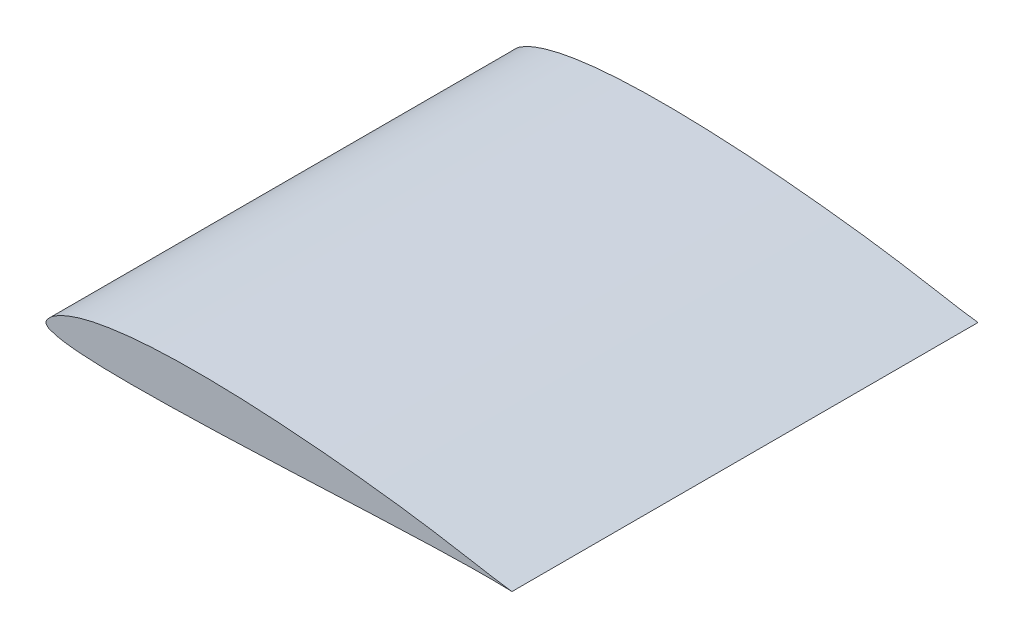
ISO-10303-21;
HEADER;
FILE_DESCRIPTION(('STEP AP214'),'2;1');
FILE_NAME('part.step','',(''),(''),'','','');
FILE_SCHEMA(('AUTOMOTIVE_DESIGN { 1 0 10303 214 1 1 1 1 }'));
ENDSEC;
DATA;
#1=APPLICATION_CONTEXT('core data for automotive mechanical design processes');
#2=APPLICATION_PROTOCOL_DEFINITION('international standard','automotive_design',2000,#1);
#3=PRODUCT_CONTEXT('',#1,'mechanical');
#4=PRODUCT('Part','Part','',(#3));
#5=PRODUCT_RELATED_PRODUCT_CATEGORY('part','',(#4));
#6=PRODUCT_DEFINITION_FORMATION('','',#4);
#7=PRODUCT_DEFINITION_CONTEXT('part definition',#1,'design');
#8=PRODUCT_DEFINITION('design','',#6,#7);
#9=PRODUCT_DEFINITION_SHAPE('','',#8);
#10=(LENGTH_UNIT() NAMED_UNIT(*) SI_UNIT(.MILLI.,.METRE.));
#11=(NAMED_UNIT(*) PLANE_ANGLE_UNIT() SI_UNIT($,.RADIAN.));
#12=(NAMED_UNIT(*) SI_UNIT($,.STERADIAN.) SOLID_ANGLE_UNIT());
#13=UNCERTAINTY_MEASURE_WITH_UNIT(LENGTH_MEASURE(1.E-05),#10,'distance_accuracy_value','');
#14=(GEOMETRIC_REPRESENTATION_CONTEXT(3) GLOBAL_UNCERTAINTY_ASSIGNED_CONTEXT((#13)) GLOBAL_UNIT_ASSIGNED_CONTEXT((#10,
#11,#12)) REPRESENTATION_CONTEXT('',''));
#15=CARTESIAN_POINT('',(0.,0.,0.));
#16=DIRECTION('',(0.,0.,1.));
#17=DIRECTION('',(1.,0.,0.));
#18=AXIS2_PLACEMENT_3D('',#15,#16,#17);
#19=CARTESIAN_POINT('',(1.,0.,1.));
#20=CARTESIAN_POINT('',(0.998903108389076,0.000121406919845207,1.));
#21=CARTESIAN_POINT('',(0.994565905079208,0.000601460271834748,1.));
#22=CARTESIAN_POINT('',(0.984999997094092,0.00186259580160997,1.));
#23=CARTESIAN_POINT('',(0.969484159213962,0.00419062092315832,1.));
#24=CARTESIAN_POINT('',(0.94852981486566,0.00767819555314547,1.));
#25=CARTESIAN_POINT('',(0.922672969154077,0.0121988139570707,1.));
#26=CARTESIAN_POINT('',(0.892439862173384,0.0175292659432753,1.));
#27=CARTESIAN_POINT('',(0.858309632667853,0.0233782153322246,1.));
#28=CARTESIAN_POINT('',(0.820694397345579,0.029436711137859,1.));
#29=CARTESIAN_POINT('',(0.779952035008533,0.0354183285929598,1.));
#30=CARTESIAN_POINT('',(0.736439055940032,0.0411612482671573,1.));
#31=CARTESIAN_POINT('',(0.690574078001588,0.046627683015533,1.));
#32=CARTESIAN_POINT('',(0.626206910458004,0.053558876111652,1.));
#33=CARTESIAN_POINT('',(0.543750962488218,0.06097339298864,1.));
#34=CARTESIAN_POINT('',(0.460771418306333,0.0662636356078057,1.));
#35=CARTESIAN_POINT('',(0.379551076185033,0.0694455408081705,1.));
#36=CARTESIAN_POINT('',(0.317100783518963,0.0702246324498102,1.));
#37=CARTESIAN_POINT('',(0.257287933385218,0.068807398931094,1.));
#38=CARTESIAN_POINT('',(0.216031914679377,0.0666956214640016,1.));
#39=CARTESIAN_POINT('',(0.177714572532986,0.0634576097537422,1.));
#40=CARTESIAN_POINT('',(0.142632529788051,0.059163438915296,1.));
#41=CARTESIAN_POINT('',(0.111052130966285,0.053832558883784,1.));
#42=CARTESIAN_POINT('',(0.0831776594807825,0.0475706724374463,1.));
#43=CARTESIAN_POINT('',(0.0591851423395838,0.0405148147700546,1.));
#44=CARTESIAN_POINT('',(0.0391449791284586,0.0328216438461388,1.));
#45=CARTESIAN_POINT('',(0.0232548066729585,0.0247366898042465,1.));
#46=CARTESIAN_POINT('',(0.0111865794514499,0.0166108905907611,1.));
#47=CARTESIAN_POINT('',(0.00377453743947742,0.00882373706582297,1.));
#48=CARTESIAN_POINT('',(-0.00112026256867486,0.00133272283312862,1.));
#49=CARTESIAN_POINT('',(0.00221524465422324,-0.00657330858305878,1.));
#50=CARTESIAN_POINT('',(0.0117647193312377,-0.0101491259482753,1.));
#51=CARTESIAN_POINT('',(0.0248965369724214,-0.0142858560350523,1.));
#52=CARTESIAN_POINT('',(0.0435918648352995,-0.0173485716257503,1.));
#53=CARTESIAN_POINT('',(0.0670348468084242,-0.0199603256660386,1.));
#54=CARTESIAN_POINT('',(0.0953417597588834,-0.0217839385020737,1.));
#55=CARTESIAN_POINT('',(0.128175653732335,-0.0229506381550848,1.));
#56=CARTESIAN_POINT('',(0.165268517453682,-0.0234753172246174,1.));
#57=CARTESIAN_POINT('',(0.222054551139734,-0.0234408340170418,1.));
#58=CARTESIAN_POINT('',(0.283068635955884,-0.0223834976662773,1.));
#59=CARTESIAN_POINT('',(0.365319495418615,-0.0201313137595818,1.));
#60=CARTESIAN_POINT('',(0.434815088185333,-0.0176766346552293,1.));
#61=CARTESIAN_POINT('',(0.505626194390846,-0.0148220661877479,1.));
#62=CARTESIAN_POINT('',(0.559284840368821,-0.0125179152456767,1.));
#63=CARTESIAN_POINT('',(0.612437183947094,-0.0101717114113715,1.));
#64=CARTESIAN_POINT('',(0.664475391394637,-0.00784425997932924,1.));
#65=CARTESIAN_POINT('',(0.714791147043999,-0.0056588648655388,1.));
#66=CARTESIAN_POINT('',(0.762772300527216,-0.00365816302224017,1.));
#67=CARTESIAN_POINT('',(0.807809389098344,-0.00201401694656956,1.));
#68=CARTESIAN_POINT('',(0.849289307956989,-0.000708153071829051,1.));
#69=CARTESIAN_POINT('',(0.88663727977917,0.000183559389752817,1.));
#70=CARTESIAN_POINT('',(0.919314986347022,0.00071457037326223,1.));
#71=CARTESIAN_POINT('',(0.946846557872802,0.000918232220023281,1.));
#72=CARTESIAN_POINT('',(0.968797691905805,0.000815243181055258,1.));
#73=CARTESIAN_POINT('',(0.984799457252058,0.000567604250269155,1.));
#74=CARTESIAN_POINT('',(0.993436890231737,0.000264760895431089,1.));
#75=CARTESIAN_POINT('',(0.99671,0.00015,1.));
#76=B_SPLINE_CURVE_WITH_KNOTS('',3,(#19,#20,#21,#22,#23,#24,#25,#26,#27,#28,#29,#30,#31,#32,#33,
#34,#35,#36,#37,#38,#39,#40,#41,#42,#43,#44,#45,#46,#47,#48,#49,#50,#51,#52,#53,#54,#55,#56,#57,
#58,#59,#60,#61,#62,#63,#64,#65,#66,#67,#68,#69,#70,#71,#72,#73,#74,#75),.UNSPECIFIED.,.F.,.F.,
(4,1,1,1,1,1,1,1,1,1,1,1,1,1,1,1,1,1,1,1,1,1,1,1,1,1,1,1,1,1,1,1,1,1,1,1,1,1,1,1,1,1,1,1,1,1,1,
1,1,1,1,1,1,1,4),(0.,0.00163535583425859,0.00646633693476806,0.0142965918772175,
0.0248842088552096,0.0379439925510076,0.0531941368467982,0.0703765688743697,0.0892572179770475,
0.109651763058439,0.131396199224683,0.154294670265703,0.178096902835302,0.227328973387424,
0.276966075496197,0.301296827478668,0.347773045551505,0.369493848961825,0.389946984550237,
0.40897941596321,0.426465789850067,0.442306728816157,0.456421239565711,0.46877353813753,
0.47934514980936,0.488155641306995,0.495223141471028,0.500608247512498,0.504417035913407,
0.507344225330662,0.511892730711683,0.518766332626908,0.528062399813873,0.539750485293801,
0.553781923901918,0.570059197087642,0.588441486429501,0.608747967256935,0.654207709776473,
0.678865071069041,0.73067750330715,0.757253936726054,0.783882586633168,0.810265561255861,
0.836095192051152,0.861073222293053,0.884896986100605,0.907258357413886,0.927856250220039,
0.946394646161361,0.962618153964165,0.976286171395789,0.987192827864271,0.995146789524168,1.),.UNSPECIFIED.);
#77=DIRECTION('',(0.,0.,-1.));
#78=VECTOR('',#77,1.);
#79=SURFACE_OF_LINEAR_EXTRUSION('',#76,#78);
#80=CARTESIAN_POINT('',(1.,0.,0.));
#81=CARTESIAN_POINT('',(0.998903108389076,0.000121406919845207,0.));
#82=CARTESIAN_POINT('',(0.994565905079208,0.000601460271834748,0.));
#83=CARTESIAN_POINT('',(0.984999997094092,0.00186259580160997,0.));
#84=CARTESIAN_POINT('',(0.969484159213962,0.00419062092315832,0.));
#85=CARTESIAN_POINT('',(0.94852981486566,0.00767819555314547,0.));
#86=CARTESIAN_POINT('',(0.922672969154077,0.0121988139570707,0.));
#87=CARTESIAN_POINT('',(0.892439862173384,0.0175292659432753,0.));
#88=CARTESIAN_POINT('',(0.858309632667853,0.0233782153322246,0.));
#89=CARTESIAN_POINT('',(0.820694397345579,0.029436711137859,0.));
#90=CARTESIAN_POINT('',(0.779952035008533,0.0354183285929598,0.));
#91=CARTESIAN_POINT('',(0.736439055940032,0.0411612482671573,0.));
#92=CARTESIAN_POINT('',(0.690574078001588,0.046627683015533,0.));
#93=CARTESIAN_POINT('',(0.626206910458004,0.053558876111652,0.));
#94=CARTESIAN_POINT('',(0.543750962488218,0.06097339298864,0.));
#95=CARTESIAN_POINT('',(0.460771418306333,0.0662636356078057,0.));
#96=CARTESIAN_POINT('',(0.379551076185033,0.0694455408081705,0.));
#97=CARTESIAN_POINT('',(0.317100783518963,0.0702246324498102,0.));
#98=CARTESIAN_POINT('',(0.257287933385218,0.068807398931094,0.));
#99=CARTESIAN_POINT('',(0.216031914679377,0.0666956214640016,0.));
#100=CARTESIAN_POINT('',(0.177714572532986,0.0634576097537422,0.));
#101=CARTESIAN_POINT('',(0.142632529788051,0.059163438915296,0.));
#102=CARTESIAN_POINT('',(0.111052130966285,0.053832558883784,0.));
#103=CARTESIAN_POINT('',(0.0831776594807825,0.0475706724374463,0.));
#104=CARTESIAN_POINT('',(0.0591851423395838,0.0405148147700546,0.));
#105=CARTESIAN_POINT('',(0.0391449791284586,0.0328216438461388,0.));
#106=CARTESIAN_POINT('',(0.0232548066729585,0.0247366898042465,0.));
#107=CARTESIAN_POINT('',(0.0111865794514499,0.0166108905907611,0.));
#108=CARTESIAN_POINT('',(0.00377453743947742,0.00882373706582297,0.));
#109=CARTESIAN_POINT('',(-0.00112026256867486,0.00133272283312862,0.));
#110=CARTESIAN_POINT('',(0.00221524465422324,-0.00657330858305878,0.));
#111=CARTESIAN_POINT('',(0.0117647193312377,-0.0101491259482753,0.));
#112=CARTESIAN_POINT('',(0.0248965369724214,-0.0142858560350523,0.));
#113=CARTESIAN_POINT('',(0.0435918648352995,-0.0173485716257503,0.));
#114=CARTESIAN_POINT('',(0.0670348468084242,-0.0199603256660386,0.));
#115=CARTESIAN_POINT('',(0.0953417597588834,-0.0217839385020737,0.));
#116=CARTESIAN_POINT('',(0.128175653732335,-0.0229506381550848,0.));
#117=CARTESIAN_POINT('',(0.165268517453682,-0.0234753172246174,0.));
#118=CARTESIAN_POINT('',(0.222054551139734,-0.0234408340170418,0.));
#119=CARTESIAN_POINT('',(0.283068635955884,-0.0223834976662773,0.));
#120=CARTESIAN_POINT('',(0.365319495418615,-0.0201313137595818,0.));
#121=CARTESIAN_POINT('',(0.434815088185333,-0.0176766346552293,0.));
#122=CARTESIAN_POINT('',(0.505626194390846,-0.0148220661877479,0.));
#123=CARTESIAN_POINT('',(0.559284840368821,-0.0125179152456767,0.));
#124=CARTESIAN_POINT('',(0.612437183947094,-0.0101717114113715,0.));
#125=CARTESIAN_POINT('',(0.664475391394637,-0.00784425997932924,0.));
#126=CARTESIAN_POINT('',(0.714791147043999,-0.0056588648655388,0.));
#127=CARTESIAN_POINT('',(0.762772300527216,-0.00365816302224017,0.));
#128=CARTESIAN_POINT('',(0.807809389098344,-0.00201401694656956,0.));
#129=CARTESIAN_POINT('',(0.849289307956989,-0.000708153071829051,0.));
#130=CARTESIAN_POINT('',(0.88663727977917,0.000183559389752817,0.));
#131=CARTESIAN_POINT('',(0.919314986347022,0.00071457037326223,0.));
#132=CARTESIAN_POINT('',(0.946846557872802,0.000918232220023281,0.));
#133=CARTESIAN_POINT('',(0.968797691905805,0.000815243181055258,0.));
#134=CARTESIAN_POINT('',(0.984799457252058,0.000567604250269155,0.));
#135=CARTESIAN_POINT('',(0.993436890231737,0.000264760895431089,0.));
#136=CARTESIAN_POINT('',(0.99671,0.00015,0.));
#137=B_SPLINE_CURVE_WITH_KNOTS('',3,(#80,#81,#82,#83,#84,#85,#86,#87,#88,#89,#90,#91,#92,#93,
#94,#95,#96,#97,#98,#99,#100,#101,#102,#103,#104,#105,#106,#107,#108,#109,#110,#111,#112,#113,
#114,#115,#116,#117,#118,#119,#120,#121,#122,#123,#124,#125,#126,#127,#128,#129,#130,#131,#132,
#133,#134,#135,#136),.UNSPECIFIED.,.F.,.F.,(4,1,1,1,1,1,1,1,1,1,1,1,1,1,1,1,1,1,1,1,1,1,1,1,1,1,
1,1,1,1,1,1,1,1,1,1,1,1,1,1,1,1,1,1,1,1,1,1,1,1,1,1,1,1,4),(0.,0.00163535583425859,
0.00646633693476806,0.0142965918772175,0.0248842088552096,0.0379439925510076,0.0531941368467982,
0.0703765688743697,0.0892572179770475,0.109651763058439,0.131396199224683,0.154294670265703,
0.178096902835302,0.227328973387424,0.276966075496197,0.301296827478668,0.347773045551505,
0.369493848961825,0.389946984550237,0.40897941596321,0.426465789850067,0.442306728816157,
0.456421239565711,0.46877353813753,0.47934514980936,0.488155641306995,0.495223141471028,
0.500608247512498,0.504417035913407,0.507344225330662,0.511892730711683,0.518766332626908,
0.528062399813873,0.539750485293801,0.553781923901918,0.570059197087642,0.588441486429501,
0.608747967256935,0.654207709776473,0.678865071069041,0.73067750330715,0.757253936726054,
0.783882586633168,0.810265561255861,0.836095192051152,0.861073222293053,0.884896986100605,
0.907258357413886,0.927856250220039,0.946394646161361,0.962618153964165,0.976286171395789,
0.987192827864271,0.995146789524168,1.),.UNSPECIFIED.);
#138=CARTESIAN_POINT('',(1.,0.,0.));
#139=VERTEX_POINT('',#138);
#140=CARTESIAN_POINT('',(0.99671,0.00015,0.));
#141=VERTEX_POINT('',#140);
#142=EDGE_CURVE('E79',#139,#141,#137,.T.);
#143=ORIENTED_EDGE('',*,*,#142,.T.);
#144=DIRECTION('',(0.,0.,-1.));
#145=VECTOR('',#144,1.);
#146=CARTESIAN_POINT('',(0.99671,0.00015,1.));
#147=LINE('',#146,#145);
#148=CARTESIAN_POINT('',(0.99671,0.00015,1.));
#149=VERTEX_POINT('',#148);
#150=EDGE_CURVE('E11',#149,#141,#147,.T.);
#151=ORIENTED_EDGE('',*,*,#150,.F.);
#152=CARTESIAN_POINT('',(1.,0.,1.));
#153=VERTEX_POINT('',#152);
#154=EDGE_CURVE('E78',#153,#149,#76,.T.);
#155=ORIENTED_EDGE('',*,*,#154,.F.);
#156=DIRECTION('',(0.,0.,-1.));
#157=VECTOR('',#156,1.);
#158=CARTESIAN_POINT('',(1.,0.,1.));
#159=LINE('',#158,#157);
#160=EDGE_CURVE('E55',#153,#139,#159,.T.);
#161=ORIENTED_EDGE('',*,*,#160,.T.);
#162=EDGE_LOOP('',(#143,#151,#155,#161));
#163=FACE_BOUND('',#162,.T.);
#164=ADVANCED_FACE('F45',(#163),#79,.F.);
#165=CARTESIAN_POINT('',(0.99671,0.00015,1.));
#166=DIRECTION('',(0.0455453922574684,0.998962270180468,0.));
#167=DIRECTION('',(-0.998962270180468,0.0455453922574684,0.));
#168=AXIS2_PLACEMENT_3D('',#165,#166,#167);
#169=PLANE('',#168);
#170=DIRECTION('',(0.998962270180467,-0.0455453922574684,0.));
#171=VECTOR('',#170,1.);
#172=CARTESIAN_POINT('',(0.99671,0.00015,0.));
#173=LINE('',#172,#171);
#174=EDGE_CURVE('E70',#141,#139,#173,.T.);
#175=ORIENTED_EDGE('',*,*,#174,.T.);
#176=ORIENTED_EDGE('',*,*,#160,.F.);
#177=DIRECTION('',(0.998962270180467,-0.0455453922574684,0.));
#178=VECTOR('',#177,1.);
#179=CARTESIAN_POINT('',(0.99671,0.00015,1.));
#180=LINE('',#179,#178);
#181=EDGE_CURVE('E62',#149,#153,#180,.T.);
#182=ORIENTED_EDGE('',*,*,#181,.F.);
#183=ORIENTED_EDGE('',*,*,#150,.T.);
#184=EDGE_LOOP('',(#175,#176,#182,#183));
#185=FACE_BOUND('',#184,.T.);
#186=ADVANCED_FACE('F73',(#185),#169,.F.);
#187=CARTESIAN_POINT('',(0.00400258559000989,0.00863604615810591,1.));
#188=DIRECTION('',(0.,0.,1.));
#189=DIRECTION('',(1.,0.,0.));
#190=AXIS2_PLACEMENT_3D('',#187,#188,#189);
#191=PLANE('',#190);
#192=ORIENTED_EDGE('',*,*,#154,.T.);
#193=ORIENTED_EDGE('',*,*,#181,.T.);
#194=EDGE_LOOP('',(#192,#193));
#195=FACE_BOUND('',#194,.T.);
#196=ADVANCED_FACE('F100',(#195),#191,.T.);
#197=CARTESIAN_POINT('',(0.00400258559000989,0.00863604615810591,0.));
#198=DIRECTION('',(0.,0.,1.));
#199=DIRECTION('',(1.,0.,0.));
#200=AXIS2_PLACEMENT_3D('',#197,#198,#199);
#201=PLANE('',#200);
#202=ORIENTED_EDGE('',*,*,#142,.F.);
#203=ORIENTED_EDGE('',*,*,#174,.F.);
#204=EDGE_LOOP('',(#202,#203));
#205=FACE_BOUND('',#204,.T.);
#206=ADVANCED_FACE('F83',(#205),#201,.F.);
#207=CLOSED_SHELL('',(#164,#186,#196,#206));
#208=MANIFOLD_SOLID_BREP('B2',#207);
#209=ADVANCED_BREP_SHAPE_REPRESENTATION('',(#18,#208),#14);
#210=SHAPE_DEFINITION_REPRESENTATION(#9,#209);
ENDSEC;
END-ISO-10303-21;
